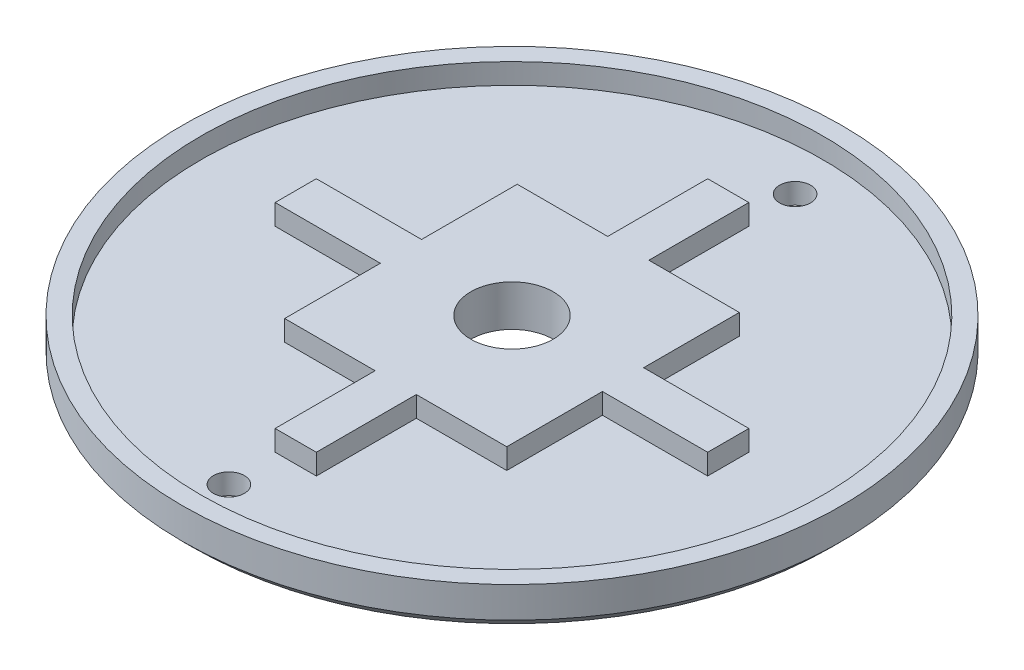
ISO-10303-21;
HEADER;
FILE_DESCRIPTION(('STEP AP214'),'2;1');
FILE_NAME('part.step','',(''),(''),'','','');
FILE_SCHEMA(('AUTOMOTIVE_DESIGN { 1 0 10303 214 1 1 1 1 }'));
ENDSEC;
DATA;
#1=APPLICATION_CONTEXT('core data for automotive mechanical design processes');
#2=APPLICATION_PROTOCOL_DEFINITION('international standard','automotive_design',2000,#1);
#3=PRODUCT_CONTEXT('',#1,'mechanical');
#4=PRODUCT('Part','Part','',(#3));
#5=PRODUCT_RELATED_PRODUCT_CATEGORY('part','',(#4));
#6=PRODUCT_DEFINITION_FORMATION('','',#4);
#7=PRODUCT_DEFINITION_CONTEXT('part definition',#1,'design');
#8=PRODUCT_DEFINITION('design','',#6,#7);
#9=PRODUCT_DEFINITION_SHAPE('','',#8);
#10=(LENGTH_UNIT() NAMED_UNIT(*) SI_UNIT(.MILLI.,.METRE.));
#11=(NAMED_UNIT(*) PLANE_ANGLE_UNIT() SI_UNIT($,.RADIAN.));
#12=(NAMED_UNIT(*) SI_UNIT($,.STERADIAN.) SOLID_ANGLE_UNIT());
#13=UNCERTAINTY_MEASURE_WITH_UNIT(LENGTH_MEASURE(1.E-05),#10,'distance_accuracy_value','');
#14=(GEOMETRIC_REPRESENTATION_CONTEXT(3) GLOBAL_UNCERTAINTY_ASSIGNED_CONTEXT((#13)) GLOBAL_UNIT_ASSIGNED_CONTEXT((#10,
#11,#12)) REPRESENTATION_CONTEXT('',''));
#15=CARTESIAN_POINT('',(0.,0.,0.));
#16=DIRECTION('',(0.,0.,1.));
#17=DIRECTION('',(1.,0.,0.));
#18=AXIS2_PLACEMENT_3D('',#15,#16,#17);
#19=CARTESIAN_POINT('',(-21.,4.,2.));
#20=DIRECTION('',(0.,0.,-1.));
#21=DIRECTION('',(-1.,0.,0.));
#22=AXIS2_PLACEMENT_3D('',#19,#20,#21);
#23=PLANE('',#22);
#24=DIRECTION('',(0.,1.,0.));
#25=VECTOR('',#24,1.);
#26=CARTESIAN_POINT('',(10.7821253545687,4.,2.));
#27=LINE('',#26,#25);
#28=CARTESIAN_POINT('',(10.7821253545686,2.,2.));
#29=VERTEX_POINT('',#28);
#30=CARTESIAN_POINT('',(10.7821253545686,4.,2.));
#31=VERTEX_POINT('',#30);
#32=EDGE_CURVE('E249',#29,#31,#27,.T.);
#33=ORIENTED_EDGE('',*,*,#32,.F.);
#34=DIRECTION('',(1.,0.,0.));
#35=VECTOR('',#34,1.);
#36=CARTESIAN_POINT('',(-21.,2.,2.));
#37=LINE('',#36,#35);
#38=CARTESIAN_POINT('',(21.,2.,2.));
#39=VERTEX_POINT('',#38);
#40=EDGE_CURVE('E277',#29,#39,#37,.T.);
#41=ORIENTED_EDGE('',*,*,#40,.T.);
#42=DIRECTION('',(0.,-1.,0.));
#43=VECTOR('',#42,1.);
#44=CARTESIAN_POINT('',(21.,4.,2.));
#45=LINE('',#44,#43);
#46=CARTESIAN_POINT('',(21.,4.,2.));
#47=VERTEX_POINT('',#46);
#48=EDGE_CURVE('E284',#47,#39,#45,.T.);
#49=ORIENTED_EDGE('',*,*,#48,.F.);
#50=DIRECTION('',(1.,0.,0.));
#51=VECTOR('',#50,1.);
#52=CARTESIAN_POINT('',(-21.,4.,2.));
#53=LINE('',#52,#51);
#54=EDGE_CURVE('E77',#31,#47,#53,.T.);
#55=ORIENTED_EDGE('',*,*,#54,.F.);
#56=EDGE_LOOP('',(#33,#41,#49,#55));
#57=FACE_BOUND('',#56,.T.);
#58=ADVANCED_FACE('F59',(#57),#23,.F.);
#59=CARTESIAN_POINT('',(-21.,4.,-2.));
#60=DIRECTION('',(0.,0.,-1.));
#61=DIRECTION('',(-1.,0.,0.));
#62=AXIS2_PLACEMENT_3D('',#59,#60,#61);
#63=PLANE('',#62);
#64=DIRECTION('',(1.,0.,0.));
#65=VECTOR('',#64,1.);
#66=CARTESIAN_POINT('',(-21.,2.,-2.));
#67=LINE('',#66,#65);
#68=CARTESIAN_POINT('',(10.7821253545686,2.,-2.));
#69=VERTEX_POINT('',#68);
#70=CARTESIAN_POINT('',(21.,2.,-2.));
#71=VERTEX_POINT('',#70);
#72=EDGE_CURVE('E269',#69,#71,#67,.T.);
#73=ORIENTED_EDGE('',*,*,#72,.F.);
#74=DIRECTION('',(0.,1.,0.));
#75=VECTOR('',#74,1.);
#76=CARTESIAN_POINT('',(10.7821253545687,4.,-2.));
#77=LINE('',#76,#75);
#78=CARTESIAN_POINT('',(10.7821253545686,4.,-2.));
#79=VERTEX_POINT('',#78);
#80=EDGE_CURVE('E85',#69,#79,#77,.T.);
#81=ORIENTED_EDGE('',*,*,#80,.T.);
#82=DIRECTION('',(1.,0.,0.));
#83=VECTOR('',#82,1.);
#84=CARTESIAN_POINT('',(-21.,4.,-2.));
#85=LINE('',#84,#83);
#86=CARTESIAN_POINT('',(21.,4.,-2.));
#87=VERTEX_POINT('',#86);
#88=EDGE_CURVE('E208',#79,#87,#85,.T.);
#89=ORIENTED_EDGE('',*,*,#88,.T.);
#90=DIRECTION('',(0.,-1.,0.));
#91=VECTOR('',#90,1.);
#92=CARTESIAN_POINT('',(21.,4.,-2.));
#93=LINE('',#92,#91);
#94=EDGE_CURVE('E287',#87,#71,#93,.T.);
#95=ORIENTED_EDGE('',*,*,#94,.T.);
#96=EDGE_LOOP('',(#73,#81,#89,#95));
#97=FACE_BOUND('',#96,.T.);
#98=ADVANCED_FACE('F438',(#97),#63,.T.);
#99=DIRECTION('',(0.,-1.,0.));
#100=VECTOR('',#99,1.);
#101=CARTESIAN_POINT('',(-10.7821253545687,4.,2.));
#102=LINE('',#101,#100);
#103=CARTESIAN_POINT('',(-10.7821253545687,4.,2.));
#104=VERTEX_POINT('',#103);
#105=CARTESIAN_POINT('',(-10.7821253545687,2.,2.));
#106=VERTEX_POINT('',#105);
#107=EDGE_CURVE('E241',#104,#106,#102,.T.);
#108=ORIENTED_EDGE('',*,*,#107,.F.);
#109=CARTESIAN_POINT('',(-21.,4.,2.));
#110=VERTEX_POINT('',#109);
#111=EDGE_CURVE('E263',#110,#104,#53,.T.);
#112=ORIENTED_EDGE('',*,*,#111,.F.);
#113=DIRECTION('',(0.,-1.,0.));
#114=VECTOR('',#113,1.);
#115=CARTESIAN_POINT('',(-21.,4.,2.));
#116=LINE('',#115,#114);
#117=CARTESIAN_POINT('',(-21.,2.,2.));
#118=VERTEX_POINT('',#117);
#119=EDGE_CURVE('E280',#110,#118,#116,.T.);
#120=ORIENTED_EDGE('',*,*,#119,.T.);
#121=EDGE_CURVE('E258',#118,#106,#37,.T.);
#122=ORIENTED_EDGE('',*,*,#121,.T.);
#123=EDGE_LOOP('',(#108,#112,#120,#122));
#124=FACE_BOUND('',#123,.T.);
#125=ADVANCED_FACE('F390',(#124),#23,.F.);
#126=CARTESIAN_POINT('',(-21.,4.,-2.));
#127=VERTEX_POINT('',#126);
#128=CARTESIAN_POINT('',(-10.7821253545687,4.,-2.));
#129=VERTEX_POINT('',#128);
#130=EDGE_CURVE('E259',#127,#129,#85,.T.);
#131=ORIENTED_EDGE('',*,*,#130,.T.);
#132=DIRECTION('',(0.,-1.,0.));
#133=VECTOR('',#132,1.);
#134=CARTESIAN_POINT('',(-10.7821253545687,4.,-2.));
#135=LINE('',#134,#133);
#136=CARTESIAN_POINT('',(-10.7821253545687,2.,-2.));
#137=VERTEX_POINT('',#136);
#138=EDGE_CURVE('E239',#129,#137,#135,.T.);
#139=ORIENTED_EDGE('',*,*,#138,.T.);
#140=CARTESIAN_POINT('',(-21.,2.,-2.));
#141=VERTEX_POINT('',#140);
#142=EDGE_CURVE('E271',#141,#137,#67,.T.);
#143=ORIENTED_EDGE('',*,*,#142,.F.);
#144=DIRECTION('',(0.,-1.,0.));
#145=VECTOR('',#144,1.);
#146=CARTESIAN_POINT('',(-21.,4.,-2.));
#147=LINE('',#146,#145);
#148=EDGE_CURVE('E266',#127,#141,#147,.T.);
#149=ORIENTED_EDGE('',*,*,#148,.F.);
#150=EDGE_LOOP('',(#131,#139,#143,#149));
#151=FACE_BOUND('',#150,.T.);
#152=ADVANCED_FACE('F441',(#151),#63,.T.);
#153=CARTESIAN_POINT('',(-2.,4.,-21.));
#154=DIRECTION('',(1.,0.,0.));
#155=DIRECTION('',(0.,0.,-1.));
#156=AXIS2_PLACEMENT_3D('',#153,#154,#155);
#157=PLANE('',#156);
#158=DIRECTION('',(0.,-1.,0.));
#159=VECTOR('',#158,1.);
#160=CARTESIAN_POINT('',(-2.,4.,-11.291152731823));
#161=LINE('',#160,#159);
#162=CARTESIAN_POINT('',(-2.,4.,-11.291152731823));
#163=VERTEX_POINT('',#162);
#164=CARTESIAN_POINT('',(-2.,2.,-11.291152731823));
#165=VERTEX_POINT('',#164);
#166=EDGE_CURVE('E245',#163,#165,#161,.T.);
#167=ORIENTED_EDGE('',*,*,#166,.F.);
#168=DIRECTION('',(0.,0.,1.));
#169=VECTOR('',#168,1.);
#170=CARTESIAN_POINT('',(-2.,4.,-21.));
#171=LINE('',#170,#169);
#172=CARTESIAN_POINT('',(-2.,4.,-21.));
#173=VERTEX_POINT('',#172);
#174=EDGE_CURVE('E303',#173,#163,#171,.T.);
#175=ORIENTED_EDGE('',*,*,#174,.F.);
#176=DIRECTION('',(0.,-1.,0.));
#177=VECTOR('',#176,1.);
#178=CARTESIAN_POINT('',(-2.,4.,-21.));
#179=LINE('',#178,#177);
#180=CARTESIAN_POINT('',(-2.,2.,-21.));
#181=VERTEX_POINT('',#180);
#182=EDGE_CURVE('E270',#173,#181,#179,.T.);
#183=ORIENTED_EDGE('',*,*,#182,.T.);
#184=DIRECTION('',(0.,0.,1.));
#185=VECTOR('',#184,1.);
#186=CARTESIAN_POINT('',(-2.,2.,-21.));
#187=LINE('',#186,#185);
#188=EDGE_CURVE('E296',#181,#165,#187,.T.);
#189=ORIENTED_EDGE('',*,*,#188,.T.);
#190=EDGE_LOOP('',(#167,#175,#183,#189));
#191=FACE_BOUND('',#190,.T.);
#192=ADVANCED_FACE('F409',(#191),#157,.F.);
#193=CARTESIAN_POINT('',(2.,4.,-21.));
#194=DIRECTION('',(1.,0.,0.));
#195=DIRECTION('',(0.,0.,-1.));
#196=AXIS2_PLACEMENT_3D('',#193,#194,#195);
#197=PLANE('',#196);
#198=DIRECTION('',(0.,0.,1.));
#199=VECTOR('',#198,1.);
#200=CARTESIAN_POINT('',(2.,4.,-21.));
#201=LINE('',#200,#199);
#202=CARTESIAN_POINT('',(2.,4.,-21.));
#203=VERTEX_POINT('',#202);
#204=CARTESIAN_POINT('',(2.,4.,-11.291152731823));
#205=VERTEX_POINT('',#204);
#206=EDGE_CURVE('E297',#203,#205,#201,.T.);
#207=ORIENTED_EDGE('',*,*,#206,.T.);
#208=DIRECTION('',(0.,-1.,0.));
#209=VECTOR('',#208,1.);
#210=CARTESIAN_POINT('',(2.,4.,-11.291152731823));
#211=LINE('',#210,#209);
#212=CARTESIAN_POINT('',(2.,2.,-11.291152731823));
#213=VERTEX_POINT('',#212);
#214=EDGE_CURVE('E220',#205,#213,#211,.T.);
#215=ORIENTED_EDGE('',*,*,#214,.T.);
#216=DIRECTION('',(0.,0.,1.));
#217=VECTOR('',#216,1.);
#218=CARTESIAN_POINT('',(2.,2.,-21.));
#219=LINE('',#218,#217);
#220=CARTESIAN_POINT('',(2.,2.,-21.));
#221=VERTEX_POINT('',#220);
#222=EDGE_CURVE('E309',#221,#213,#219,.T.);
#223=ORIENTED_EDGE('',*,*,#222,.F.);
#224=DIRECTION('',(0.,-1.,0.));
#225=VECTOR('',#224,1.);
#226=CARTESIAN_POINT('',(2.,4.,-21.));
#227=LINE('',#226,#225);
#228=EDGE_CURVE('E306',#203,#221,#227,.T.);
#229=ORIENTED_EDGE('',*,*,#228,.F.);
#230=EDGE_LOOP('',(#207,#215,#223,#229));
#231=FACE_BOUND('',#230,.T.);
#232=ADVANCED_FACE('F416',(#231),#197,.T.);
#233=DIRECTION('',(0.,1.,0.));
#234=VECTOR('',#233,1.);
#235=CARTESIAN_POINT('',(-2.,4.,11.291152731823));
#236=LINE('',#235,#234);
#237=CARTESIAN_POINT('',(-2.,2.,11.291152731823));
#238=VERTEX_POINT('',#237);
#239=CARTESIAN_POINT('',(-2.,4.,11.291152731823));
#240=VERTEX_POINT('',#239);
#241=EDGE_CURVE('E230',#238,#240,#236,.T.);
#242=ORIENTED_EDGE('',*,*,#241,.F.);
#243=CARTESIAN_POINT('',(-2.,2.,21.));
#244=VERTEX_POINT('',#243);
#245=EDGE_CURVE('E315',#238,#244,#187,.T.);
#246=ORIENTED_EDGE('',*,*,#245,.T.);
#247=DIRECTION('',(0.,-1.,0.));
#248=VECTOR('',#247,1.);
#249=CARTESIAN_POINT('',(-2.,4.,21.));
#250=LINE('',#249,#248);
#251=CARTESIAN_POINT('',(-2.,4.,21.));
#252=VERTEX_POINT('',#251);
#253=EDGE_CURVE('E320',#252,#244,#250,.T.);
#254=ORIENTED_EDGE('',*,*,#253,.F.);
#255=EDGE_CURVE('E302',#240,#252,#171,.T.);
#256=ORIENTED_EDGE('',*,*,#255,.F.);
#257=EDGE_LOOP('',(#242,#246,#254,#256));
#258=FACE_BOUND('',#257,.T.);
#259=ADVANCED_FACE('F454',(#258),#157,.F.);
#260=CARTESIAN_POINT('',(2.,2.,11.291152731823));
#261=VERTEX_POINT('',#260);
#262=CARTESIAN_POINT('',(2.,2.,21.));
#263=VERTEX_POINT('',#262);
#264=EDGE_CURVE('E308',#261,#263,#219,.T.);
#265=ORIENTED_EDGE('',*,*,#264,.F.);
#266=DIRECTION('',(0.,1.,0.));
#267=VECTOR('',#266,1.);
#268=CARTESIAN_POINT('',(2.,4.,11.291152731823));
#269=LINE('',#268,#267);
#270=CARTESIAN_POINT('',(2.,4.,11.291152731823));
#271=VERTEX_POINT('',#270);
#272=EDGE_CURVE('E227',#261,#271,#269,.T.);
#273=ORIENTED_EDGE('',*,*,#272,.T.);
#274=CARTESIAN_POINT('',(2.,4.,21.));
#275=VERTEX_POINT('',#274);
#276=EDGE_CURVE('E295',#271,#275,#201,.T.);
#277=ORIENTED_EDGE('',*,*,#276,.T.);
#278=DIRECTION('',(0.,-1.,0.));
#279=VECTOR('',#278,1.);
#280=CARTESIAN_POINT('',(2.,4.,21.));
#281=LINE('',#280,#279);
#282=EDGE_CURVE('E323',#275,#263,#281,.T.);
#283=ORIENTED_EDGE('',*,*,#282,.T.);
#284=EDGE_LOOP('',(#265,#273,#277,#283));
#285=FACE_BOUND('',#284,.T.);
#286=ADVANCED_FACE('F356',(#285),#197,.T.);
#287=CARTESIAN_POINT('',(0.,2.,0.));
#288=DIRECTION('',(0.,1.,0.));
#289=DIRECTION('',(0.,0.,1.));
#290=AXIS2_PLACEMENT_3D('',#287,#288,#289);
#291=PLANE('',#290);
#292=CARTESIAN_POINT('',(0.,2.,0.));
#293=DIRECTION('',(0.,1.,0.));
#294=DIRECTION('',(0.,0.,1.));
#295=AXIS2_PLACEMENT_3D('',#292,#293,#294);
#296=CIRCLE('',#295,30.2);
#297=CARTESIAN_POINT('',(0.,2.,30.2));
#298=VERTEX_POINT('',#297);
#299=EDGE_CURVE('E334',#298,#298,#296,.T.);
#300=ORIENTED_EDGE('',*,*,#299,.T.);
#301=EDGE_LOOP('',(#300));
#302=FACE_BOUND('',#301,.T.);
#303=CARTESIAN_POINT('',(1.5320166667153,2.,-25.9548246947064));
#304=DIRECTION('',(0.,1.,0.));
#305=DIRECTION('',(0.,0.,1.));
#306=AXIS2_PLACEMENT_3D('',#303,#304,#305);
#307=CIRCLE('',#306,1.5);
#308=CARTESIAN_POINT('',(1.5320166667153,2.,-24.4548246947064));
#309=VERTEX_POINT('',#308);
#310=EDGE_CURVE('E331',#309,#309,#307,.T.);
#311=ORIENTED_EDGE('',*,*,#310,.F.);
#312=EDGE_LOOP('',(#311));
#313=FACE_BOUND('',#312,.T.);
#314=CARTESIAN_POINT('',(-1.53200546186016,2.,25.9548253560847));
#315=DIRECTION('',(0.,1.,0.));
#316=DIRECTION('',(0.,0.,1.));
#317=AXIS2_PLACEMENT_3D('',#314,#315,#316);
#318=CIRCLE('',#317,1.5);
#319=CARTESIAN_POINT('',(-1.53200546186016,2.,27.4548253560847));
#320=VERTEX_POINT('',#319);
#321=EDGE_CURVE('E64',#320,#320,#318,.T.);
#322=ORIENTED_EDGE('',*,*,#321,.F.);
#323=EDGE_LOOP('',(#322));
#324=FACE_BOUND('',#323,.T.);
#325=DIRECTION('',(-1.,0.,0.));
#326=VECTOR('',#325,1.);
#327=CARTESIAN_POINT('',(-10.7821253545687,2.,-11.291152731823));
#328=LINE('',#327,#326);
#329=CARTESIAN_POINT('',(10.7821253545687,2.,-11.291152731823));
#330=VERTEX_POINT('',#329);
#331=EDGE_CURVE('E359',#330,#213,#328,.T.);
#332=ORIENTED_EDGE('',*,*,#331,.F.);
#333=DIRECTION('',(0.,0.,-1.));
#334=VECTOR('',#333,1.);
#335=CARTESIAN_POINT('',(10.7821253545687,2.,11.291152731823));
#336=LINE('',#335,#334);
#337=EDGE_CURVE('E226',#69,#330,#336,.T.);
#338=ORIENTED_EDGE('',*,*,#337,.F.);
#339=ORIENTED_EDGE('',*,*,#72,.T.);
#340=DIRECTION('',(0.,0.,-1.));
#341=VECTOR('',#340,1.);
#342=CARTESIAN_POINT('',(21.,2.,2.));
#343=LINE('',#342,#341);
#344=EDGE_CURVE('E274',#39,#71,#343,.T.);
#345=ORIENTED_EDGE('',*,*,#344,.F.);
#346=ORIENTED_EDGE('',*,*,#40,.F.);
#347=CARTESIAN_POINT('',(10.7821253545687,2.,11.291152731823));
#348=VERTEX_POINT('',#347);
#349=EDGE_CURVE('E368',#348,#29,#336,.T.);
#350=ORIENTED_EDGE('',*,*,#349,.F.);
#351=DIRECTION('',(1.,0.,0.));
#352=VECTOR('',#351,1.);
#353=CARTESIAN_POINT('',(-10.7821253545687,2.,11.291152731823));
#354=LINE('',#353,#352);
#355=EDGE_CURVE('E373',#261,#348,#354,.T.);
#356=ORIENTED_EDGE('',*,*,#355,.F.);
#357=ORIENTED_EDGE('',*,*,#264,.T.);
#358=DIRECTION('',(1.,0.,0.));
#359=VECTOR('',#358,1.);
#360=CARTESIAN_POINT('',(-2.,2.,21.));
#361=LINE('',#360,#359);
#362=EDGE_CURVE('E312',#244,#263,#361,.T.);
#363=ORIENTED_EDGE('',*,*,#362,.F.);
#364=ORIENTED_EDGE('',*,*,#245,.F.);
#365=CARTESIAN_POINT('',(-10.7821253545687,2.,11.291152731823));
#366=VERTEX_POINT('',#365);
#367=EDGE_CURVE('E212',#366,#238,#354,.T.);
#368=ORIENTED_EDGE('',*,*,#367,.F.);
#369=DIRECTION('',(0.,0.,1.));
#370=VECTOR('',#369,1.);
#371=CARTESIAN_POINT('',(-10.7821253545687,2.,11.291152731823));
#372=LINE('',#371,#370);
#373=EDGE_CURVE('E361',#106,#366,#372,.T.);
#374=ORIENTED_EDGE('',*,*,#373,.F.);
#375=ORIENTED_EDGE('',*,*,#121,.F.);
#376=DIRECTION('',(0.,0.,-1.));
#377=VECTOR('',#376,1.);
#378=CARTESIAN_POINT('',(-21.,2.,2.));
#379=LINE('',#378,#377);
#380=EDGE_CURVE('E267',#118,#141,#379,.T.);
#381=ORIENTED_EDGE('',*,*,#380,.T.);
#382=ORIENTED_EDGE('',*,*,#142,.T.);
#383=CARTESIAN_POINT('',(-10.7821253545687,2.,-11.291152731823));
#384=VERTEX_POINT('',#383);
#385=EDGE_CURVE('E365',#384,#137,#372,.T.);
#386=ORIENTED_EDGE('',*,*,#385,.F.);
#387=EDGE_CURVE('E362',#165,#384,#328,.T.);
#388=ORIENTED_EDGE('',*,*,#387,.F.);
#389=ORIENTED_EDGE('',*,*,#188,.F.);
#390=DIRECTION('',(1.,0.,0.));
#391=VECTOR('',#390,1.);
#392=CARTESIAN_POINT('',(-2.,2.,-21.));
#393=LINE('',#392,#391);
#394=EDGE_CURVE('E254',#181,#221,#393,.T.);
#395=ORIENTED_EDGE('',*,*,#394,.T.);
#396=ORIENTED_EDGE('',*,*,#222,.T.);
#397=EDGE_LOOP('',(#332,#338,#339,#345,#346,#350,#356,#357,#363,#364,#368,#374,#375,#381,#382,
#386,#388,#389,#395,#396));
#398=FACE_BOUND('',#397,.T.);
#399=ADVANCED_FACE('F353',(#302,#313,#324,#398),#291,.T.);
#400=CARTESIAN_POINT('',(0.,4.,0.));
#401=DIRECTION('',(0.,-1.,0.));
#402=DIRECTION('',(0.,0.,-1.));
#403=AXIS2_PLACEMENT_3D('',#400,#401,#402);
#404=PLANE('',#403);
#405=DIRECTION('',(0.,0.,-1.));
#406=VECTOR('',#405,1.);
#407=CARTESIAN_POINT('',(10.7821253545687,4.,11.291152731823));
#408=LINE('',#407,#406);
#409=CARTESIAN_POINT('',(10.7821253545687,4.,11.291152731823));
#410=VERTEX_POINT('',#409);
#411=EDGE_CURVE('E211',#410,#31,#408,.T.);
#412=ORIENTED_EDGE('',*,*,#411,.T.);
#413=ORIENTED_EDGE('',*,*,#54,.T.);
#414=DIRECTION('',(0.,0.,-1.));
#415=VECTOR('',#414,1.);
#416=CARTESIAN_POINT('',(21.,4.,2.));
#417=LINE('',#416,#415);
#418=EDGE_CURVE('E261',#47,#87,#417,.T.);
#419=ORIENTED_EDGE('',*,*,#418,.T.);
#420=ORIENTED_EDGE('',*,*,#88,.F.);
#421=CARTESIAN_POINT('',(10.7821253545687,4.,-11.291152731823));
#422=VERTEX_POINT('',#421);
#423=EDGE_CURVE('E200',#79,#422,#408,.T.);
#424=ORIENTED_EDGE('',*,*,#423,.T.);
#425=DIRECTION('',(-1.,0.,0.));
#426=VECTOR('',#425,1.);
#427=CARTESIAN_POINT('',(-10.7821253545687,4.,-11.291152731823));
#428=LINE('',#427,#426);
#429=EDGE_CURVE('E206',#422,#205,#428,.T.);
#430=ORIENTED_EDGE('',*,*,#429,.T.);
#431=ORIENTED_EDGE('',*,*,#206,.F.);
#432=DIRECTION('',(1.,0.,0.));
#433=VECTOR('',#432,1.);
#434=CARTESIAN_POINT('',(-2.,4.,-21.));
#435=LINE('',#434,#433);
#436=EDGE_CURVE('E292',#173,#203,#435,.T.);
#437=ORIENTED_EDGE('',*,*,#436,.F.);
#438=ORIENTED_EDGE('',*,*,#174,.T.);
#439=CARTESIAN_POINT('',(-10.7821253545687,4.,-11.291152731823));
#440=VERTEX_POINT('',#439);
#441=EDGE_CURVE('E222',#163,#440,#428,.T.);
#442=ORIENTED_EDGE('',*,*,#441,.T.);
#443=DIRECTION('',(0.,0.,1.));
#444=VECTOR('',#443,1.);
#445=CARTESIAN_POINT('',(-10.7821253545687,4.,11.291152731823));
#446=LINE('',#445,#444);
#447=EDGE_CURVE('E404',#440,#129,#446,.T.);
#448=ORIENTED_EDGE('',*,*,#447,.T.);
#449=ORIENTED_EDGE('',*,*,#130,.F.);
#450=DIRECTION('',(0.,0.,-1.));
#451=VECTOR('',#450,1.);
#452=CARTESIAN_POINT('',(-21.,4.,2.));
#453=LINE('',#452,#451);
#454=EDGE_CURVE('E255',#110,#127,#453,.T.);
#455=ORIENTED_EDGE('',*,*,#454,.F.);
#456=ORIENTED_EDGE('',*,*,#111,.T.);
#457=CARTESIAN_POINT('',(-10.7821253545687,4.,11.291152731823));
#458=VERTEX_POINT('',#457);
#459=EDGE_CURVE('E221',#104,#458,#446,.T.);
#460=ORIENTED_EDGE('',*,*,#459,.T.);
#461=DIRECTION('',(1.,0.,0.));
#462=VECTOR('',#461,1.);
#463=CARTESIAN_POINT('',(-10.7821253545687,4.,11.291152731823));
#464=LINE('',#463,#462);
#465=EDGE_CURVE('E378',#458,#240,#464,.T.);
#466=ORIENTED_EDGE('',*,*,#465,.T.);
#467=ORIENTED_EDGE('',*,*,#255,.T.);
#468=DIRECTION('',(1.,0.,0.));
#469=VECTOR('',#468,1.);
#470=CARTESIAN_POINT('',(-2.,4.,21.));
#471=LINE('',#470,#469);
#472=EDGE_CURVE('E299',#252,#275,#471,.T.);
#473=ORIENTED_EDGE('',*,*,#472,.T.);
#474=ORIENTED_EDGE('',*,*,#276,.F.);
#475=EDGE_CURVE('E420',#271,#410,#464,.T.);
#476=ORIENTED_EDGE('',*,*,#475,.T.);
#477=EDGE_LOOP('',(#412,#413,#419,#420,#424,#430,#431,#437,#438,#442,#448,#449,#455,#456,#460,
#466,#467,#473,#474,#476));
#478=FACE_BOUND('',#477,.T.);
#479=CARTESIAN_POINT('',(0.,4.,0.));
#480=DIRECTION('',(0.,1.,0.));
#481=DIRECTION('',(0.,0.,1.));
#482=AXIS2_PLACEMENT_3D('',#479,#480,#481);
#483=CIRCLE('',#482,4.);
#484=CARTESIAN_POINT('',(0.,4.,3.99999999999999));
#485=VERTEX_POINT('',#484);
#486=EDGE_CURVE('E718',#485,#485,#483,.T.);
#487=ORIENTED_EDGE('',*,*,#486,.F.);
#488=EDGE_LOOP('',(#487));
#489=FACE_BOUND('',#488,.T.);
#490=ADVANCED_FACE('F203',(#478,#489),#404,.F.);
#491=CARTESIAN_POINT('',(0.,4.,0.));
#492=DIRECTION('',(0.,-1.,0.));
#493=DIRECTION('',(0.,0.,-1.));
#494=AXIS2_PLACEMENT_3D('',#491,#492,#493);
#495=CYLINDRICAL_SURFACE('',#494,32.);
#496=CARTESIAN_POINT('',(0.,0.999999999999987,0.));
#497=DIRECTION('',(0.,1.,0.));
#498=DIRECTION('',(0.,0.,1.));
#499=AXIS2_PLACEMENT_3D('',#496,#497,#498);
#500=CIRCLE('',#499,32.);
#501=CARTESIAN_POINT('',(0.,0.999999999999987,32.));
#502=VERTEX_POINT('',#501);
#503=EDGE_CURVE('E69',#502,#502,#500,.T.);
#504=ORIENTED_EDGE('',*,*,#503,.T.);
#505=EDGE_LOOP('',(#504));
#506=FACE_BOUND('',#505,.T.);
#507=CARTESIAN_POINT('',(0.,4.,0.));
#508=DIRECTION('',(0.,1.,0.));
#509=DIRECTION('',(0.,0.,1.));
#510=AXIS2_PLACEMENT_3D('',#507,#508,#509);
#511=CIRCLE('',#510,32.);
#512=CARTESIAN_POINT('',(0.,4.,32.));
#513=VERTEX_POINT('',#512);
#514=EDGE_CURVE('E337',#513,#513,#511,.T.);
#515=ORIENTED_EDGE('',*,*,#514,.F.);
#516=EDGE_LOOP('',(#515));
#517=FACE_BOUND('',#516,.T.);
#518=ADVANCED_FACE('F496',(#506,#517),#495,.T.);
#519=CARTESIAN_POINT('',(0.,4.,0.));
#520=DIRECTION('',(0.,1.,0.));
#521=DIRECTION('',(0.,0.,1.));
#522=AXIS2_PLACEMENT_3D('',#519,#520,#521);
#523=PLANE('',#522);
#524=CARTESIAN_POINT('',(0.,4.,0.));
#525=DIRECTION('',(0.,1.,0.));
#526=DIRECTION('',(0.,0.,1.));
#527=AXIS2_PLACEMENT_3D('',#524,#525,#526);
#528=CIRCLE('',#527,30.2);
#529=CARTESIAN_POINT('',(0.,4.,30.2));
#530=VERTEX_POINT('',#529);
#531=EDGE_CURVE('E338',#530,#530,#528,.T.);
#532=ORIENTED_EDGE('',*,*,#531,.F.);
#533=EDGE_LOOP('',(#532));
#534=FACE_BOUND('',#533,.T.);
#535=ORIENTED_EDGE('',*,*,#514,.T.);
#536=EDGE_LOOP('',(#535));
#537=FACE_BOUND('',#536,.T.);
#538=ADVANCED_FACE('F493',(#534,#537),#523,.T.);
#539=CARTESIAN_POINT('',(0.,0.,0.));
#540=DIRECTION('',(0.,1.,0.));
#541=DIRECTION('',(0.,0.,1.));
#542=AXIS2_PLACEMENT_3D('',#539,#540,#541);
#543=PLANE('',#542);
#544=CARTESIAN_POINT('',(0.,0.,0.));
#545=DIRECTION('',(0.,1.,0.));
#546=DIRECTION('',(0.,0.,1.));
#547=AXIS2_PLACEMENT_3D('',#544,#545,#546);
#548=CIRCLE('',#547,4.);
#549=CARTESIAN_POINT('',(0.,0.,4.));
#550=VERTEX_POINT('',#549);
#551=EDGE_CURVE('E251',#550,#550,#548,.T.);
#552=ORIENTED_EDGE('',*,*,#551,.T.);
#553=EDGE_LOOP('',(#552));
#554=FACE_BOUND('',#553,.T.);
#555=CARTESIAN_POINT('',(-1.53200546186016,0.,25.9548253560847));
#556=DIRECTION('',(0.,-1.,0.));
#557=DIRECTION('',(0.,0.,-1.));
#558=AXIS2_PLACEMENT_3D('',#555,#556,#557);
#559=CIRCLE('',#558,1.5);
#560=CARTESIAN_POINT('',(-1.53200546186016,0.,24.4548253560847));
#561=VERTEX_POINT('',#560);
#562=EDGE_CURVE('E328',#561,#561,#559,.T.);
#563=ORIENTED_EDGE('',*,*,#562,.F.);
#564=EDGE_LOOP('',(#563));
#565=FACE_BOUND('',#564,.T.);
#566=CARTESIAN_POINT('',(1.5320166667153,0.,-25.9548246947064));
#567=DIRECTION('',(0.,-1.,0.));
#568=DIRECTION('',(0.,0.,-1.));
#569=AXIS2_PLACEMENT_3D('',#566,#567,#568);
#570=CIRCLE('',#569,1.5);
#571=CARTESIAN_POINT('',(1.5320166667153,0.,-27.4548246947064));
#572=VERTEX_POINT('',#571);
#573=EDGE_CURVE('E283',#572,#572,#570,.T.);
#574=ORIENTED_EDGE('',*,*,#573,.F.);
#575=EDGE_LOOP('',(#574));
#576=FACE_BOUND('',#575,.T.);
#577=CARTESIAN_POINT('',(0.,0.,0.));
#578=DIRECTION('',(0.,1.,0.));
#579=DIRECTION('',(0.,0.,1.));
#580=AXIS2_PLACEMENT_3D('',#577,#578,#579);
#581=CIRCLE('',#580,31.);
#582=CARTESIAN_POINT('',(0.,0.,31.));
#583=VERTEX_POINT('',#582);
#584=EDGE_CURVE('E12',#583,#583,#581,.F.);
#585=ORIENTED_EDGE('',*,*,#584,.T.);
#586=EDGE_LOOP('',(#585));
#587=FACE_BOUND('',#586,.T.);
#588=ADVANCED_FACE('F491',(#554,#565,#576,#587),#543,.F.);
#589=CARTESIAN_POINT('',(0.,2.,0.));
#590=DIRECTION('',(0.,1.,0.));
#591=DIRECTION('',(0.,0.,1.));
#592=AXIS2_PLACEMENT_3D('',#589,#590,#591);
#593=CYLINDRICAL_SURFACE('',#592,30.2);
#594=ORIENTED_EDGE('',*,*,#299,.F.);
#595=EDGE_LOOP('',(#594));
#596=FACE_BOUND('',#595,.T.);
#597=ORIENTED_EDGE('',*,*,#531,.T.);
#598=EDGE_LOOP('',(#597));
#599=FACE_BOUND('',#598,.T.);
#600=ADVANCED_FACE('F488',(#596,#599),#593,.F.);
#601=CARTESIAN_POINT('',(0.,0.999999999999987,0.));
#602=DIRECTION('',(0.,1.,0.));
#603=DIRECTION('',(0.,0.,1.));
#604=AXIS2_PLACEMENT_3D('',#601,#602,#603);
#605=CONICAL_SURFACE('',#604,32.,0.785398163397452);
#606=ORIENTED_EDGE('',*,*,#584,.F.);
#607=EDGE_LOOP('',(#606));
#608=FACE_BOUND('',#607,.T.);
#609=ORIENTED_EDGE('',*,*,#503,.F.);
#610=EDGE_LOOP('',(#609));
#611=FACE_BOUND('',#610,.T.);
#612=ADVANCED_FACE('F62',(#608,#611),#605,.T.);
#613=CARTESIAN_POINT('',(1.5320166667153,15.,-25.9548246947064));
#614=DIRECTION('',(0.,-1.,0.));
#615=DIRECTION('',(0.,0.,-1.));
#616=AXIS2_PLACEMENT_3D('',#613,#614,#615);
#617=CYLINDRICAL_SURFACE('',#616,1.5);
#618=ORIENTED_EDGE('',*,*,#310,.T.);
#619=EDGE_LOOP('',(#618));
#620=FACE_BOUND('',#619,.T.);
#621=ORIENTED_EDGE('',*,*,#573,.T.);
#622=EDGE_LOOP('',(#621));
#623=FACE_BOUND('',#622,.T.);
#624=ADVANCED_FACE('F485',(#620,#623),#617,.F.);
#625=CARTESIAN_POINT('',(-1.53200546186016,15.,25.9548253560847));
#626=DIRECTION('',(0.,-1.,0.));
#627=DIRECTION('',(0.,0.,-1.));
#628=AXIS2_PLACEMENT_3D('',#625,#626,#627);
#629=CYLINDRICAL_SURFACE('',#628,1.5);
#630=ORIENTED_EDGE('',*,*,#321,.T.);
#631=EDGE_LOOP('',(#630));
#632=FACE_BOUND('',#631,.T.);
#633=ORIENTED_EDGE('',*,*,#562,.T.);
#634=EDGE_LOOP('',(#633));
#635=FACE_BOUND('',#634,.T.);
#636=ADVANCED_FACE('F350',(#632,#635),#629,.F.);
#637=CARTESIAN_POINT('',(21.,4.,2.));
#638=DIRECTION('',(-1.,0.,0.));
#639=DIRECTION('',(0.,0.,1.));
#640=AXIS2_PLACEMENT_3D('',#637,#638,#639);
#641=PLANE('',#640);
#642=ORIENTED_EDGE('',*,*,#344,.T.);
#643=ORIENTED_EDGE('',*,*,#94,.F.);
#644=ORIENTED_EDGE('',*,*,#418,.F.);
#645=ORIENTED_EDGE('',*,*,#48,.T.);
#646=EDGE_LOOP('',(#642,#643,#644,#645));
#647=FACE_BOUND('',#646,.T.);
#648=ADVANCED_FACE('F437',(#647),#641,.F.);
#649=CARTESIAN_POINT('',(-21.,4.,2.));
#650=DIRECTION('',(-1.,0.,0.));
#651=DIRECTION('',(0.,0.,1.));
#652=AXIS2_PLACEMENT_3D('',#649,#650,#651);
#653=PLANE('',#652);
#654=ORIENTED_EDGE('',*,*,#380,.F.);
#655=ORIENTED_EDGE('',*,*,#119,.F.);
#656=ORIENTED_EDGE('',*,*,#454,.T.);
#657=ORIENTED_EDGE('',*,*,#148,.T.);
#658=EDGE_LOOP('',(#654,#655,#656,#657));
#659=FACE_BOUND('',#658,.T.);
#660=ADVANCED_FACE('F395',(#659),#653,.T.);
#661=CARTESIAN_POINT('',(-2.,4.,-21.));
#662=DIRECTION('',(0.,0.,-1.));
#663=DIRECTION('',(-1.,0.,0.));
#664=AXIS2_PLACEMENT_3D('',#661,#662,#663);
#665=PLANE('',#664);
#666=ORIENTED_EDGE('',*,*,#394,.F.);
#667=ORIENTED_EDGE('',*,*,#182,.F.);
#668=ORIENTED_EDGE('',*,*,#436,.T.);
#669=ORIENTED_EDGE('',*,*,#228,.T.);
#670=EDGE_LOOP('',(#666,#667,#668,#669));
#671=FACE_BOUND('',#670,.T.);
#672=ADVANCED_FACE('F414',(#671),#665,.T.);
#673=CARTESIAN_POINT('',(-2.,4.,21.));
#674=DIRECTION('',(0.,0.,-1.));
#675=DIRECTION('',(-1.,0.,0.));
#676=AXIS2_PLACEMENT_3D('',#673,#674,#675);
#677=PLANE('',#676);
#678=ORIENTED_EDGE('',*,*,#362,.T.);
#679=ORIENTED_EDGE('',*,*,#282,.F.);
#680=ORIENTED_EDGE('',*,*,#472,.F.);
#681=ORIENTED_EDGE('',*,*,#253,.T.);
#682=EDGE_LOOP('',(#678,#679,#680,#681));
#683=FACE_BOUND('',#682,.T.);
#684=ADVANCED_FACE('F472',(#683),#677,.F.);
#685=CARTESIAN_POINT('',(0.,-6.,0.));
#686=DIRECTION('',(0.,1.,0.));
#687=DIRECTION('',(0.,0.,1.));
#688=AXIS2_PLACEMENT_3D('',#685,#686,#687);
#689=CYLINDRICAL_SURFACE('',#688,4.);
#690=ORIENTED_EDGE('',*,*,#551,.F.);
#691=EDGE_LOOP('',(#690));
#692=FACE_BOUND('',#691,.T.);
#693=ORIENTED_EDGE('',*,*,#486,.T.);
#694=EDGE_LOOP('',(#693));
#695=FACE_BOUND('',#694,.T.);
#696=ADVANCED_FACE('F474',(#692,#695),#689,.F.);
#697=CARTESIAN_POINT('',(10.7821253545687,4.,11.291152731823));
#698=DIRECTION('',(-1.,0.,0.));
#699=DIRECTION('',(0.,0.,1.));
#700=AXIS2_PLACEMENT_3D('',#697,#698,#699);
#701=PLANE('',#700);
#702=ORIENTED_EDGE('',*,*,#349,.T.);
#703=ORIENTED_EDGE('',*,*,#32,.T.);
#704=ORIENTED_EDGE('',*,*,#411,.F.);
#705=DIRECTION('',(0.,-1.,0.));
#706=VECTOR('',#705,1.);
#707=CARTESIAN_POINT('',(10.7821253545687,4.,11.291152731823));
#708=LINE('',#707,#706);
#709=EDGE_CURVE('E376',#410,#348,#708,.T.);
#710=ORIENTED_EDGE('',*,*,#709,.T.);
#711=EDGE_LOOP('',(#702,#703,#704,#710));
#712=FACE_BOUND('',#711,.T.);
#713=ADVANCED_FACE('F431',(#712),#701,.F.);
#714=CARTESIAN_POINT('',(-10.7821253545687,4.,-11.291152731823));
#715=DIRECTION('',(0.,0.,1.));
#716=DIRECTION('',(1.,0.,0.));
#717=AXIS2_PLACEMENT_3D('',#714,#715,#716);
#718=PLANE('',#717);
#719=ORIENTED_EDGE('',*,*,#441,.F.);
#720=ORIENTED_EDGE('',*,*,#166,.T.);
#721=ORIENTED_EDGE('',*,*,#387,.T.);
#722=DIRECTION('',(0.,-1.,0.));
#723=VECTOR('',#722,1.);
#724=CARTESIAN_POINT('',(-10.7821253545687,4.,-11.291152731823));
#725=LINE('',#724,#723);
#726=EDGE_CURVE('E228',#440,#384,#725,.T.);
#727=ORIENTED_EDGE('',*,*,#726,.F.);
#728=EDGE_LOOP('',(#719,#720,#721,#727));
#729=FACE_BOUND('',#728,.T.);
#730=ADVANCED_FACE('F407',(#729),#718,.F.);
#731=CARTESIAN_POINT('',(-10.7821253545687,4.,11.291152731823));
#732=DIRECTION('',(1.,0.,0.));
#733=DIRECTION('',(0.,0.,-1.));
#734=AXIS2_PLACEMENT_3D('',#731,#732,#733);
#735=PLANE('',#734);
#736=ORIENTED_EDGE('',*,*,#459,.F.);
#737=ORIENTED_EDGE('',*,*,#107,.T.);
#738=ORIENTED_EDGE('',*,*,#373,.T.);
#739=DIRECTION('',(0.,-1.,0.));
#740=VECTOR('',#739,1.);
#741=CARTESIAN_POINT('',(-10.7821253545687,4.,11.291152731823));
#742=LINE('',#741,#740);
#743=EDGE_CURVE('E233',#458,#366,#742,.T.);
#744=ORIENTED_EDGE('',*,*,#743,.F.);
#745=EDGE_LOOP('',(#736,#737,#738,#744));
#746=FACE_BOUND('',#745,.T.);
#747=ADVANCED_FACE('F387',(#746),#735,.F.);
#748=CARTESIAN_POINT('',(-10.7821253545687,4.,11.291152731823));
#749=DIRECTION('',(0.,0.,-1.));
#750=DIRECTION('',(-1.,0.,0.));
#751=AXIS2_PLACEMENT_3D('',#748,#749,#750);
#752=PLANE('',#751);
#753=ORIENTED_EDGE('',*,*,#367,.T.);
#754=ORIENTED_EDGE('',*,*,#241,.T.);
#755=ORIENTED_EDGE('',*,*,#465,.F.);
#756=ORIENTED_EDGE('',*,*,#743,.T.);
#757=EDGE_LOOP('',(#753,#754,#755,#756));
#758=FACE_BOUND('',#757,.T.);
#759=ADVANCED_FACE('F383',(#758),#752,.F.);
#760=ORIENTED_EDGE('',*,*,#80,.F.);
#761=ORIENTED_EDGE('',*,*,#337,.T.);
#762=DIRECTION('',(0.,-1.,0.));
#763=VECTOR('',#762,1.);
#764=CARTESIAN_POINT('',(10.7821253545687,4.,-11.291152731823));
#765=LINE('',#764,#763);
#766=EDGE_CURVE('E219',#422,#330,#765,.T.);
#767=ORIENTED_EDGE('',*,*,#766,.F.);
#768=ORIENTED_EDGE('',*,*,#423,.F.);
#769=EDGE_LOOP('',(#760,#761,#767,#768));
#770=FACE_BOUND('',#769,.T.);
#771=ADVANCED_FACE('F225',(#770),#701,.F.);
#772=ORIENTED_EDGE('',*,*,#214,.F.);
#773=ORIENTED_EDGE('',*,*,#429,.F.);
#774=ORIENTED_EDGE('',*,*,#766,.T.);
#775=ORIENTED_EDGE('',*,*,#331,.T.);
#776=EDGE_LOOP('',(#772,#773,#774,#775));
#777=FACE_BOUND('',#776,.T.);
#778=ADVANCED_FACE('F217',(#777),#718,.F.);
#779=ORIENTED_EDGE('',*,*,#138,.F.);
#780=ORIENTED_EDGE('',*,*,#447,.F.);
#781=ORIENTED_EDGE('',*,*,#726,.T.);
#782=ORIENTED_EDGE('',*,*,#385,.T.);
#783=EDGE_LOOP('',(#779,#780,#781,#782));
#784=FACE_BOUND('',#783,.T.);
#785=ADVANCED_FACE('F400',(#784),#735,.F.);
#786=ORIENTED_EDGE('',*,*,#272,.F.);
#787=ORIENTED_EDGE('',*,*,#355,.T.);
#788=ORIENTED_EDGE('',*,*,#709,.F.);
#789=ORIENTED_EDGE('',*,*,#475,.F.);
#790=EDGE_LOOP('',(#786,#787,#788,#789));
#791=FACE_BOUND('',#790,.T.);
#792=ADVANCED_FACE('F428',(#791),#752,.F.);
#793=CLOSED_SHELL('',(#58,#98,#125,#152,#192,#232,#259,#286,#399,#490,#518,#538,#588,#600,#612,
#624,#636,#648,#660,#672,#684,#696,#713,#730,#747,#759,#771,#778,#785,#792));
#794=MANIFOLD_SOLID_BREP('B2',#793);
#795=ADVANCED_BREP_SHAPE_REPRESENTATION('',(#18,#794),#14);
#796=SHAPE_DEFINITION_REPRESENTATION(#9,#795);
ENDSEC;
END-ISO-10303-21;
